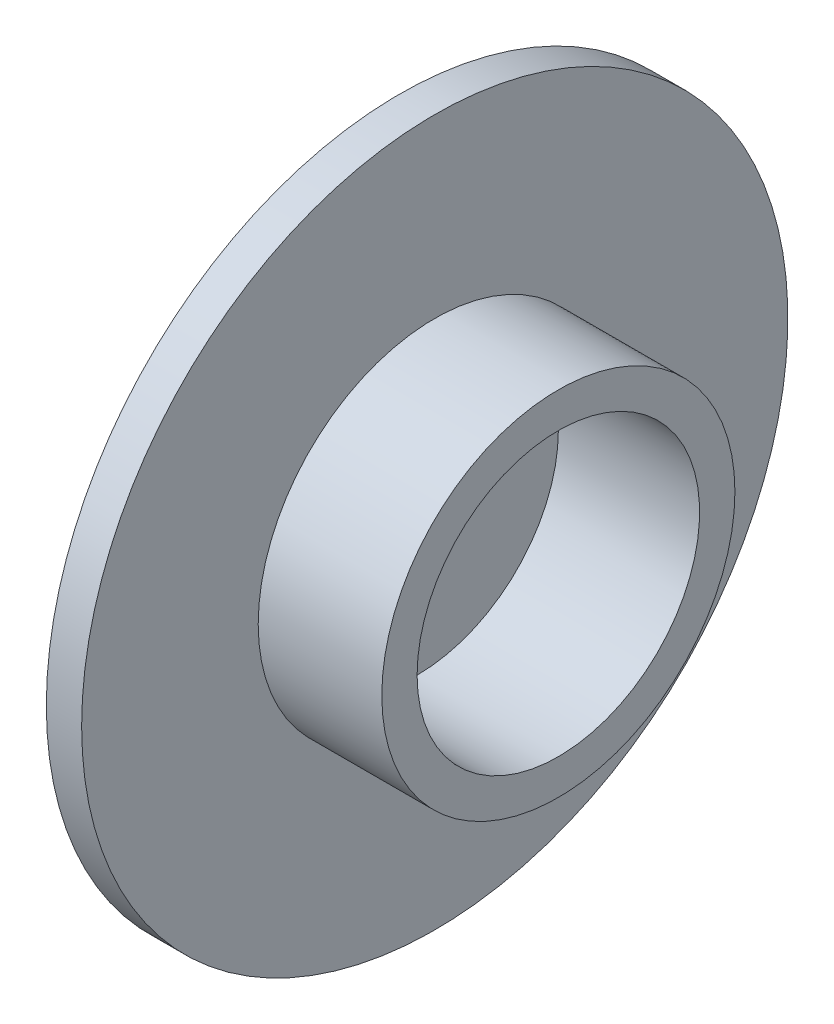
ISO-10303-21;
HEADER;
FILE_DESCRIPTION(('STEP AP214'),'2;1');
FILE_NAME('part.step','',(''),(''),'','','');
FILE_SCHEMA(('AUTOMOTIVE_DESIGN { 1 0 10303 214 1 1 1 1 }'));
ENDSEC;
DATA;
#1=APPLICATION_CONTEXT('core data for automotive mechanical design processes');
#2=APPLICATION_PROTOCOL_DEFINITION('international standard','automotive_design',2000,#1);
#3=PRODUCT_CONTEXT('',#1,'mechanical');
#4=PRODUCT('Part','Part','',(#3));
#5=PRODUCT_RELATED_PRODUCT_CATEGORY('part','',(#4));
#6=PRODUCT_DEFINITION_FORMATION('','',#4);
#7=PRODUCT_DEFINITION_CONTEXT('part definition',#1,'design');
#8=PRODUCT_DEFINITION('design','',#6,#7);
#9=PRODUCT_DEFINITION_SHAPE('','',#8);
#10=(LENGTH_UNIT() NAMED_UNIT(*) SI_UNIT(.MILLI.,.METRE.));
#11=(NAMED_UNIT(*) PLANE_ANGLE_UNIT() SI_UNIT($,.RADIAN.));
#12=(NAMED_UNIT(*) SI_UNIT($,.STERADIAN.) SOLID_ANGLE_UNIT());
#13=UNCERTAINTY_MEASURE_WITH_UNIT(LENGTH_MEASURE(1.E-05),#10,'distance_accuracy_value','');
#14=(GEOMETRIC_REPRESENTATION_CONTEXT(3) GLOBAL_UNCERTAINTY_ASSIGNED_CONTEXT((#13)) GLOBAL_UNIT_ASSIGNED_CONTEXT((#10,
#11,#12)) REPRESENTATION_CONTEXT('',''));
#15=CARTESIAN_POINT('',(0.,0.,0.));
#16=DIRECTION('',(0.,0.,1.));
#17=DIRECTION('',(1.,0.,0.));
#18=AXIS2_PLACEMENT_3D('',#15,#16,#17);
#19=CARTESIAN_POINT('',(0.905904645059556,-9.58157510670805,0.));
#20=DIRECTION('',(-1.,0.,0.));
#21=DIRECTION('',(0.,0.,1.));
#22=AXIS2_PLACEMENT_3D('',#19,#20,#21);
#23=CYLINDRICAL_SURFACE('',#22,20.);
#24=CARTESIAN_POINT('',(0.905904645059554,-9.58157510670805,0.));
#25=DIRECTION('',(-1.,0.,0.));
#26=DIRECTION('',(0.,0.,1.));
#27=AXIS2_PLACEMENT_3D('',#24,#25,#26);
#28=CIRCLE('',#27,20.);
#29=CARTESIAN_POINT('',(0.905904645059554,-9.58157510670805,20.));
#30=VERTEX_POINT('',#29);
#31=EDGE_CURVE('E10',#30,#30,#28,.T.);
#32=ORIENTED_EDGE('',*,*,#31,.F.);
#33=EDGE_LOOP('',(#32));
#34=FACE_BOUND('',#33,.T.);
#35=CARTESIAN_POINT('',(2.90590464505955,-9.58157510670805,0.));
#36=DIRECTION('',(-1.,0.,0.));
#37=DIRECTION('',(0.,0.,1.));
#38=AXIS2_PLACEMENT_3D('',#35,#36,#37);
#39=CIRCLE('',#38,20.);
#40=CARTESIAN_POINT('',(2.90590464505955,-9.58157510670805,20.));
#41=VERTEX_POINT('',#40);
#42=EDGE_CURVE('E49',#41,#41,#39,.T.);
#43=ORIENTED_EDGE('',*,*,#42,.T.);
#44=EDGE_LOOP('',(#43));
#45=FACE_BOUND('',#44,.T.);
#46=ADVANCED_FACE('F41',(#34,#45),#23,.T.);
#47=CARTESIAN_POINT('',(2.90590464505955,10.418424893292,0.));
#48=DIRECTION('',(-1.,0.,0.));
#49=DIRECTION('',(0.,0.,1.));
#50=AXIS2_PLACEMENT_3D('',#47,#48,#49);
#51=PLANE('',#50);
#52=ORIENTED_EDGE('',*,*,#42,.F.);
#53=EDGE_LOOP('',(#52));
#54=FACE_BOUND('',#53,.T.);
#55=CARTESIAN_POINT('',(2.90590464505956,-9.58157510670805,0.));
#56=DIRECTION('',(-1.,0.,0.));
#57=DIRECTION('',(0.,0.,1.));
#58=AXIS2_PLACEMENT_3D('',#55,#56,#57);
#59=CIRCLE('',#58,10.);
#60=CARTESIAN_POINT('',(2.90590464505956,-9.58157510670805,10.));
#61=VERTEX_POINT('',#60);
#62=EDGE_CURVE('E54',#61,#61,#59,.T.);
#63=ORIENTED_EDGE('',*,*,#62,.T.);
#64=EDGE_LOOP('',(#63));
#65=FACE_BOUND('',#64,.T.);
#66=ADVANCED_FACE('F85',(#54,#65),#51,.F.);
#67=CARTESIAN_POINT('',(0.905904645059556,-9.58157510670805,0.));
#68=DIRECTION('',(-1.,0.,0.));
#69=DIRECTION('',(0.,0.,1.));
#70=AXIS2_PLACEMENT_3D('',#67,#68,#69);
#71=CYLINDRICAL_SURFACE('',#70,10.);
#72=ORIENTED_EDGE('',*,*,#62,.F.);
#73=EDGE_LOOP('',(#72));
#74=FACE_BOUND('',#73,.T.);
#75=CARTESIAN_POINT('',(9.90590464505956,-9.58157510670805,0.));
#76=DIRECTION('',(-1.,0.,0.));
#77=DIRECTION('',(0.,0.,1.));
#78=AXIS2_PLACEMENT_3D('',#75,#76,#77);
#79=CIRCLE('',#78,10.);
#80=CARTESIAN_POINT('',(9.90590464505956,-9.58157510670805,10.));
#81=VERTEX_POINT('',#80);
#82=EDGE_CURVE('E60',#81,#81,#79,.T.);
#83=ORIENTED_EDGE('',*,*,#82,.T.);
#84=EDGE_LOOP('',(#83));
#85=FACE_BOUND('',#84,.T.);
#86=ADVANCED_FACE('F90',(#74,#85),#71,.T.);
#87=CARTESIAN_POINT('',(9.90590464505956,-1.58157510670805,0.));
#88=DIRECTION('',(-1.,0.,0.));
#89=DIRECTION('',(0.,0.,1.));
#90=AXIS2_PLACEMENT_3D('',#87,#88,#89);
#91=PLANE('',#90);
#92=ORIENTED_EDGE('',*,*,#82,.F.);
#93=EDGE_LOOP('',(#92));
#94=FACE_BOUND('',#93,.T.);
#95=CARTESIAN_POINT('',(9.90590464505956,-9.58157510670805,0.));
#96=DIRECTION('',(-1.,0.,0.));
#97=DIRECTION('',(0.,0.,1.));
#98=AXIS2_PLACEMENT_3D('',#95,#96,#97);
#99=CIRCLE('',#98,8.);
#100=CARTESIAN_POINT('',(9.90590464505956,-9.58157510670805,8.));
#101=VERTEX_POINT('',#100);
#102=EDGE_CURVE('E64',#101,#101,#99,.T.);
#103=ORIENTED_EDGE('',*,*,#102,.T.);
#104=EDGE_LOOP('',(#103));
#105=FACE_BOUND('',#104,.T.);
#106=ADVANCED_FACE('F99',(#94,#105),#91,.F.);
#107=CARTESIAN_POINT('',(0.905904645059556,-9.58157510670805,0.));
#108=DIRECTION('',(-1.,0.,0.));
#109=DIRECTION('',(0.,0.,1.));
#110=AXIS2_PLACEMENT_3D('',#107,#108,#109);
#111=CYLINDRICAL_SURFACE('',#110,8.);
#112=CARTESIAN_POINT('',(1.90590464505955,-9.58157510670805,0.));
#113=DIRECTION('',(1.,0.,0.));
#114=DIRECTION('',(0.,0.,-1.));
#115=AXIS2_PLACEMENT_3D('',#112,#113,#114);
#116=CIRCLE('',#115,8.);
#117=CARTESIAN_POINT('',(1.90590464505955,-9.58157510670805,-8.));
#118=VERTEX_POINT('',#117);
#119=EDGE_CURVE('E44',#118,#118,#116,.F.);
#120=ORIENTED_EDGE('',*,*,#119,.T.);
#121=EDGE_LOOP('',(#120));
#122=FACE_BOUND('',#121,.T.);
#123=ORIENTED_EDGE('',*,*,#102,.F.);
#124=EDGE_LOOP('',(#123));
#125=FACE_BOUND('',#124,.T.);
#126=ADVANCED_FACE('F73',(#122,#125),#111,.F.);
#127=CARTESIAN_POINT('',(0.905904645059554,8.41842489329195,0.));
#128=DIRECTION('',(1.,0.,0.));
#129=DIRECTION('',(0.,0.,-1.));
#130=AXIS2_PLACEMENT_3D('',#127,#128,#129);
#131=PLANE('',#130);
#132=ORIENTED_EDGE('',*,*,#31,.T.);
#133=EDGE_LOOP('',(#132));
#134=FACE_BOUND('',#133,.T.);
#135=ADVANCED_FACE('F78',(#134),#131,.F.);
#136=CARTESIAN_POINT('',(1.90590464505955,-9.58157510670805,0.));
#137=DIRECTION('',(1.,0.,0.));
#138=DIRECTION('',(0.,0.,-1.));
#139=AXIS2_PLACEMENT_3D('',#136,#137,#138);
#140=PLANE('',#139);
#141=ORIENTED_EDGE('',*,*,#119,.F.);
#142=EDGE_LOOP('',(#141));
#143=FACE_BOUND('',#142,.T.);
#144=ADVANCED_FACE('F76',(#143),#140,.T.);
#145=CLOSED_SHELL('',(#46,#66,#86,#106,#126,#135,#144));
#146=MANIFOLD_SOLID_BREP('B2',#145);
#147=ADVANCED_BREP_SHAPE_REPRESENTATION('',(#18,#146),#14);
#148=SHAPE_DEFINITION_REPRESENTATION(#9,#147);
ENDSEC;
END-ISO-10303-21;
